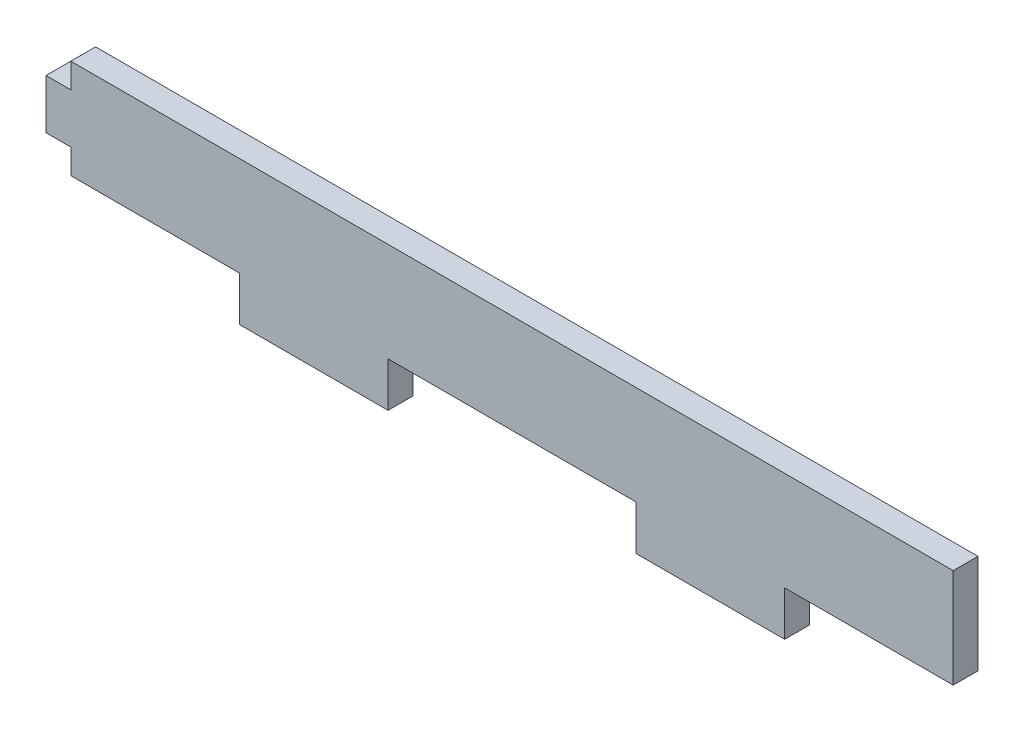
ISO-10303-21;
HEADER;
FILE_DESCRIPTION(('STEP AP214'),'2;1');
FILE_NAME('part.step','',(''),(''),'','','');
FILE_SCHEMA(('AUTOMOTIVE_DESIGN { 1 0 10303 214 1 1 1 1 }'));
ENDSEC;
DATA;
#1=APPLICATION_CONTEXT('core data for automotive mechanical design processes');
#2=APPLICATION_PROTOCOL_DEFINITION('international standard','automotive_design',2000,#1);
#3=PRODUCT_CONTEXT('',#1,'mechanical');
#4=PRODUCT('Part','Part','',(#3));
#5=PRODUCT_RELATED_PRODUCT_CATEGORY('part','',(#4));
#6=PRODUCT_DEFINITION_FORMATION('','',#4);
#7=PRODUCT_DEFINITION_CONTEXT('part definition',#1,'design');
#8=PRODUCT_DEFINITION('design','',#6,#7);
#9=PRODUCT_DEFINITION_SHAPE('','',#8);
#10=(LENGTH_UNIT() NAMED_UNIT(*) SI_UNIT(.MILLI.,.METRE.));
#11=(NAMED_UNIT(*) PLANE_ANGLE_UNIT() SI_UNIT($,.RADIAN.));
#12=(NAMED_UNIT(*) SI_UNIT($,.STERADIAN.) SOLID_ANGLE_UNIT());
#13=UNCERTAINTY_MEASURE_WITH_UNIT(LENGTH_MEASURE(1.E-05),#10,'distance_accuracy_value','');
#14=(GEOMETRIC_REPRESENTATION_CONTEXT(3) GLOBAL_UNCERTAINTY_ASSIGNED_CONTEXT((#13)) GLOBAL_UNIT_ASSIGNED_CONTEXT((#10,
#11,#12)) REPRESENTATION_CONTEXT('',''));
#15=CARTESIAN_POINT('',(0.,0.,0.));
#16=DIRECTION('',(0.,0.,1.));
#17=DIRECTION('',(1.,0.,0.));
#18=AXIS2_PLACEMENT_3D('',#15,#16,#17);
#19=CARTESIAN_POINT('',(0.,5.5,5.));
#20=DIRECTION('',(0.,1.,0.));
#21=DIRECTION('',(0.,0.,1.));
#22=AXIS2_PLACEMENT_3D('',#19,#20,#21);
#23=PLANE('',#22);
#24=DIRECTION('',(1.,0.,0.));
#25=VECTOR('',#24,1.);
#26=CARTESIAN_POINT('',(0.,5.5,0.));
#27=LINE('',#26,#25);
#28=CARTESIAN_POINT('',(149.,5.5,0.));
#29=VERTEX_POINT('',#28);
#30=CARTESIAN_POINT('',(183.,5.5,0.));
#31=VERTEX_POINT('',#30);
#32=EDGE_CURVE('E193',#29,#31,#27,.T.);
#33=ORIENTED_EDGE('',*,*,#32,.T.);
#34=DIRECTION('',(0.,0.,-1.));
#35=VECTOR('',#34,1.);
#36=CARTESIAN_POINT('',(183.,5.5,5.));
#37=LINE('',#36,#35);
#38=CARTESIAN_POINT('',(183.,5.5,5.));
#39=VERTEX_POINT('',#38);
#40=EDGE_CURVE('E11',#39,#31,#37,.T.);
#41=ORIENTED_EDGE('',*,*,#40,.F.);
#42=DIRECTION('',(1.,0.,0.));
#43=VECTOR('',#42,1.);
#44=CARTESIAN_POINT('',(0.,5.5,5.));
#45=LINE('',#44,#43);
#46=CARTESIAN_POINT('',(149.,5.5,5.));
#47=VERTEX_POINT('',#46);
#48=EDGE_CURVE('E234',#47,#39,#45,.T.);
#49=ORIENTED_EDGE('',*,*,#48,.F.);
#50=DIRECTION('',(0.,0.,-1.));
#51=VECTOR('',#50,1.);
#52=CARTESIAN_POINT('',(149.,5.5,5.));
#53=LINE('',#52,#51);
#54=EDGE_CURVE('E63',#47,#29,#53,.T.);
#55=ORIENTED_EDGE('',*,*,#54,.T.);
#56=EDGE_LOOP('',(#33,#41,#49,#55));
#57=FACE_BOUND('',#56,.T.);
#58=ADVANCED_FACE('F47',(#57),#23,.F.);
#59=CARTESIAN_POINT('',(183.,0.,5.));
#60=DIRECTION('',(-1.,0.,0.));
#61=DIRECTION('',(0.,0.,1.));
#62=AXIS2_PLACEMENT_3D('',#59,#60,#61);
#63=PLANE('',#62);
#64=DIRECTION('',(0.,1.,0.));
#65=VECTOR('',#64,1.);
#66=CARTESIAN_POINT('',(183.,0.,0.));
#67=LINE('',#66,#65);
#68=CARTESIAN_POINT('',(183.,25.5,0.));
#69=VERTEX_POINT('',#68);
#70=EDGE_CURVE('E195',#31,#69,#67,.T.);
#71=ORIENTED_EDGE('',*,*,#70,.T.);
#72=DIRECTION('',(0.,0.,-1.));
#73=VECTOR('',#72,1.);
#74=CARTESIAN_POINT('',(183.,25.5,5.));
#75=LINE('',#74,#73);
#76=CARTESIAN_POINT('',(183.,25.5,5.));
#77=VERTEX_POINT('',#76);
#78=EDGE_CURVE('E55',#77,#69,#75,.T.);
#79=ORIENTED_EDGE('',*,*,#78,.F.);
#80=DIRECTION('',(0.,1.,0.));
#81=VECTOR('',#80,1.);
#82=CARTESIAN_POINT('',(183.,0.,5.));
#83=LINE('',#82,#81);
#84=EDGE_CURVE('E126',#39,#77,#83,.T.);
#85=ORIENTED_EDGE('',*,*,#84,.F.);
#86=ORIENTED_EDGE('',*,*,#40,.T.);
#87=EDGE_LOOP('',(#71,#79,#85,#86));
#88=FACE_BOUND('',#87,.T.);
#89=ADVANCED_FACE('F265',(#88),#63,.F.);
#90=CARTESIAN_POINT('',(0.,25.5,5.));
#91=DIRECTION('',(0.,1.,0.));
#92=DIRECTION('',(0.,0.,1.));
#93=AXIS2_PLACEMENT_3D('',#90,#91,#92);
#94=PLANE('',#93);
#95=DIRECTION('',(1.,0.,0.));
#96=VECTOR('',#95,1.);
#97=CARTESIAN_POINT('',(0.,25.5,0.));
#98=LINE('',#97,#96);
#99=CARTESIAN_POINT('',(5.,25.5,0.));
#100=VERTEX_POINT('',#99);
#101=EDGE_CURVE('E198',#100,#69,#98,.T.);
#102=ORIENTED_EDGE('',*,*,#101,.F.);
#103=DIRECTION('',(0.,0.,-1.));
#104=VECTOR('',#103,1.);
#105=CARTESIAN_POINT('',(5.,25.5,5.));
#106=LINE('',#105,#104);
#107=CARTESIAN_POINT('',(5.,25.5,5.));
#108=VERTEX_POINT('',#107);
#109=EDGE_CURVE('E258',#108,#100,#106,.T.);
#110=ORIENTED_EDGE('',*,*,#109,.F.);
#111=DIRECTION('',(1.,0.,0.));
#112=VECTOR('',#111,1.);
#113=CARTESIAN_POINT('',(0.,25.5,5.));
#114=LINE('',#113,#112);
#115=EDGE_CURVE('E264',#108,#77,#114,.T.);
#116=ORIENTED_EDGE('',*,*,#115,.T.);
#117=ORIENTED_EDGE('',*,*,#78,.T.);
#118=EDGE_LOOP('',(#102,#110,#116,#117));
#119=FACE_BOUND('',#118,.T.);
#120=ADVANCED_FACE('F262',(#119),#94,.T.);
#121=CARTESIAN_POINT('',(5.,0.,5.));
#122=DIRECTION('',(-1.,0.,0.));
#123=DIRECTION('',(0.,0.,1.));
#124=AXIS2_PLACEMENT_3D('',#121,#122,#123);
#125=PLANE('',#124);
#126=DIRECTION('',(0.,1.,0.));
#127=VECTOR('',#126,1.);
#128=CARTESIAN_POINT('',(5.,0.,0.));
#129=LINE('',#128,#127);
#130=CARTESIAN_POINT('',(5.,20.5,0.));
#131=VERTEX_POINT('',#130);
#132=EDGE_CURVE('E201',#131,#100,#129,.T.);
#133=ORIENTED_EDGE('',*,*,#132,.F.);
#134=DIRECTION('',(0.,0.,-1.));
#135=VECTOR('',#134,1.);
#136=CARTESIAN_POINT('',(5.,20.5,5.));
#137=LINE('',#136,#135);
#138=CARTESIAN_POINT('',(5.,20.5,5.));
#139=VERTEX_POINT('',#138);
#140=EDGE_CURVE('E256',#139,#131,#137,.T.);
#141=ORIENTED_EDGE('',*,*,#140,.F.);
#142=DIRECTION('',(0.,1.,0.));
#143=VECTOR('',#142,1.);
#144=CARTESIAN_POINT('',(5.,0.,5.));
#145=LINE('',#144,#143);
#146=EDGE_CURVE('E276',#139,#108,#145,.T.);
#147=ORIENTED_EDGE('',*,*,#146,.T.);
#148=ORIENTED_EDGE('',*,*,#109,.T.);
#149=EDGE_LOOP('',(#133,#141,#147,#148));
#150=FACE_BOUND('',#149,.T.);
#151=ADVANCED_FACE('F272',(#150),#125,.T.);
#152=CARTESIAN_POINT('',(0.,20.5,5.));
#153=DIRECTION('',(0.,-1.,0.));
#154=DIRECTION('',(0.,0.,-1.));
#155=AXIS2_PLACEMENT_3D('',#152,#153,#154);
#156=PLANE('',#155);
#157=DIRECTION('',(-1.,0.,0.));
#158=VECTOR('',#157,1.);
#159=CARTESIAN_POINT('',(0.,20.5,0.));
#160=LINE('',#159,#158);
#161=CARTESIAN_POINT('',(0.,20.5,0.));
#162=VERTEX_POINT('',#161);
#163=EDGE_CURVE('E204',#131,#162,#160,.T.);
#164=ORIENTED_EDGE('',*,*,#163,.T.);
#165=DIRECTION('',(0.,0.,-1.));
#166=VECTOR('',#165,1.);
#167=CARTESIAN_POINT('',(0.,20.5,5.));
#168=LINE('',#167,#166);
#169=CARTESIAN_POINT('',(0.,20.5,5.));
#170=VERTEX_POINT('',#169);
#171=EDGE_CURVE('E254',#170,#162,#168,.T.);
#172=ORIENTED_EDGE('',*,*,#171,.F.);
#173=DIRECTION('',(-1.,0.,0.));
#174=VECTOR('',#173,1.);
#175=CARTESIAN_POINT('',(0.,20.5,5.));
#176=LINE('',#175,#174);
#177=EDGE_CURVE('E278',#139,#170,#176,.T.);
#178=ORIENTED_EDGE('',*,*,#177,.F.);
#179=ORIENTED_EDGE('',*,*,#140,.T.);
#180=EDGE_LOOP('',(#164,#172,#178,#179));
#181=FACE_BOUND('',#180,.T.);
#182=ADVANCED_FACE('F435',(#181),#156,.F.);
#183=CARTESIAN_POINT('',(0.,0.,5.));
#184=DIRECTION('',(-1.,0.,0.));
#185=DIRECTION('',(0.,0.,1.));
#186=AXIS2_PLACEMENT_3D('',#183,#184,#185);
#187=PLANE('',#186);
#188=DIRECTION('',(0.,1.,0.));
#189=VECTOR('',#188,1.);
#190=CARTESIAN_POINT('',(0.,0.,0.));
#191=LINE('',#190,#189);
#192=CARTESIAN_POINT('',(0.,10.5,0.));
#193=VERTEX_POINT('',#192);
#194=EDGE_CURVE('E207',#193,#162,#191,.T.);
#195=ORIENTED_EDGE('',*,*,#194,.F.);
#196=DIRECTION('',(0.,0.,-1.));
#197=VECTOR('',#196,1.);
#198=CARTESIAN_POINT('',(0.,10.5,5.));
#199=LINE('',#198,#197);
#200=CARTESIAN_POINT('',(0.,10.5,5.));
#201=VERTEX_POINT('',#200);
#202=EDGE_CURVE('E252',#201,#193,#199,.T.);
#203=ORIENTED_EDGE('',*,*,#202,.F.);
#204=DIRECTION('',(0.,1.,0.));
#205=VECTOR('',#204,1.);
#206=CARTESIAN_POINT('',(0.,0.,5.));
#207=LINE('',#206,#205);
#208=EDGE_CURVE('E284',#201,#170,#207,.T.);
#209=ORIENTED_EDGE('',*,*,#208,.T.);
#210=ORIENTED_EDGE('',*,*,#171,.T.);
#211=EDGE_LOOP('',(#195,#203,#209,#210));
#212=FACE_BOUND('',#211,.T.);
#213=ADVANCED_FACE('F424',(#212),#187,.T.);
#214=CARTESIAN_POINT('',(0.,10.5,5.));
#215=DIRECTION('',(0.,-1.,0.));
#216=DIRECTION('',(1.,0.,0.));
#217=AXIS2_PLACEMENT_3D('',#214,#215,#216);
#218=PLANE('',#217);
#219=DIRECTION('',(-1.,0.,0.));
#220=VECTOR('',#219,1.);
#221=CARTESIAN_POINT('',(0.,10.5,0.));
#222=LINE('',#221,#220);
#223=CARTESIAN_POINT('',(5.,10.5,0.));
#224=VERTEX_POINT('',#223);
#225=EDGE_CURVE('E210',#224,#193,#222,.T.);
#226=ORIENTED_EDGE('',*,*,#225,.F.);
#227=DIRECTION('',(0.,0.,-1.));
#228=VECTOR('',#227,1.);
#229=CARTESIAN_POINT('',(5.,10.5,5.));
#230=LINE('',#229,#228);
#231=CARTESIAN_POINT('',(5.,10.5,5.));
#232=VERTEX_POINT('',#231);
#233=EDGE_CURVE('E250',#232,#224,#230,.T.);
#234=ORIENTED_EDGE('',*,*,#233,.F.);
#235=DIRECTION('',(-1.,0.,0.));
#236=VECTOR('',#235,1.);
#237=CARTESIAN_POINT('',(0.,10.5,5.));
#238=LINE('',#237,#236);
#239=EDGE_CURVE('E287',#232,#201,#238,.T.);
#240=ORIENTED_EDGE('',*,*,#239,.T.);
#241=ORIENTED_EDGE('',*,*,#202,.T.);
#242=EDGE_LOOP('',(#226,#234,#240,#241));
#243=FACE_BOUND('',#242,.T.);
#244=ADVANCED_FACE('F414',(#243),#218,.T.);
#245=CARTESIAN_POINT('',(5.,0.,5.));
#246=DIRECTION('',(-1.,0.,0.));
#247=DIRECTION('',(0.,0.,1.));
#248=AXIS2_PLACEMENT_3D('',#245,#246,#247);
#249=PLANE('',#248);
#250=DIRECTION('',(0.,1.,0.));
#251=VECTOR('',#250,1.);
#252=CARTESIAN_POINT('',(5.,0.,0.));
#253=LINE('',#252,#251);
#254=CARTESIAN_POINT('',(5.,5.5,0.));
#255=VERTEX_POINT('',#254);
#256=EDGE_CURVE('E213',#255,#224,#253,.T.);
#257=ORIENTED_EDGE('',*,*,#256,.F.);
#258=DIRECTION('',(0.,0.,-1.));
#259=VECTOR('',#258,1.);
#260=CARTESIAN_POINT('',(5.,5.5,5.));
#261=LINE('',#260,#259);
#262=CARTESIAN_POINT('',(5.,5.5,5.));
#263=VERTEX_POINT('',#262);
#264=EDGE_CURVE('E248',#263,#255,#261,.T.);
#265=ORIENTED_EDGE('',*,*,#264,.F.);
#266=DIRECTION('',(0.,1.,0.));
#267=VECTOR('',#266,1.);
#268=CARTESIAN_POINT('',(5.,0.,5.));
#269=LINE('',#268,#267);
#270=EDGE_CURVE('E290',#263,#232,#269,.T.);
#271=ORIENTED_EDGE('',*,*,#270,.T.);
#272=ORIENTED_EDGE('',*,*,#233,.T.);
#273=EDGE_LOOP('',(#257,#265,#271,#272));
#274=FACE_BOUND('',#273,.T.);
#275=ADVANCED_FACE('F404',(#274),#249,.T.);
#276=CARTESIAN_POINT('',(0.,5.5,5.));
#277=DIRECTION('',(0.,1.,0.));
#278=DIRECTION('',(0.,0.,1.));
#279=AXIS2_PLACEMENT_3D('',#276,#277,#278);
#280=PLANE('',#279);
#281=DIRECTION('',(1.,0.,0.));
#282=VECTOR('',#281,1.);
#283=CARTESIAN_POINT('',(0.,5.5,0.));
#284=LINE('',#283,#282);
#285=CARTESIAN_POINT('',(39.,5.5,0.));
#286=VERTEX_POINT('',#285);
#287=EDGE_CURVE('E216',#255,#286,#284,.T.);
#288=ORIENTED_EDGE('',*,*,#287,.T.);
#289=DIRECTION('',(0.,0.,-1.));
#290=VECTOR('',#289,1.);
#291=CARTESIAN_POINT('',(39.,5.5,5.));
#292=LINE('',#291,#290);
#293=CARTESIAN_POINT('',(39.,5.5,5.));
#294=VERTEX_POINT('',#293);
#295=EDGE_CURVE('E245',#294,#286,#292,.T.);
#296=ORIENTED_EDGE('',*,*,#295,.F.);
#297=DIRECTION('',(1.,0.,0.));
#298=VECTOR('',#297,1.);
#299=CARTESIAN_POINT('',(0.,5.5,5.));
#300=LINE('',#299,#298);
#301=EDGE_CURVE('E293',#263,#294,#300,.T.);
#302=ORIENTED_EDGE('',*,*,#301,.F.);
#303=ORIENTED_EDGE('',*,*,#264,.T.);
#304=EDGE_LOOP('',(#288,#296,#302,#303));
#305=FACE_BOUND('',#304,.T.);
#306=ADVANCED_FACE('F394',(#305),#280,.F.);
#307=CARTESIAN_POINT('',(39.,0.,5.));
#308=DIRECTION('',(1.,0.,0.));
#309=DIRECTION('',(0.,0.,-1.));
#310=AXIS2_PLACEMENT_3D('',#307,#308,#309);
#311=PLANE('',#310);
#312=DIRECTION('',(0.,-1.,0.));
#313=VECTOR('',#312,1.);
#314=CARTESIAN_POINT('',(39.,0.,0.));
#315=LINE('',#314,#313);
#316=CARTESIAN_POINT('',(39.,-3.5,0.));
#317=VERTEX_POINT('',#316);
#318=EDGE_CURVE('E218',#286,#317,#315,.T.);
#319=ORIENTED_EDGE('',*,*,#318,.T.);
#320=DIRECTION('',(0.,0.,-1.));
#321=VECTOR('',#320,1.);
#322=CARTESIAN_POINT('',(39.,-3.5,5.));
#323=LINE('',#322,#321);
#324=CARTESIAN_POINT('',(39.,-3.5,5.));
#325=VERTEX_POINT('',#324);
#326=EDGE_CURVE('E242',#325,#317,#323,.T.);
#327=ORIENTED_EDGE('',*,*,#326,.F.);
#328=DIRECTION('',(0.,-1.,0.));
#329=VECTOR('',#328,1.);
#330=CARTESIAN_POINT('',(39.,0.,5.));
#331=LINE('',#330,#329);
#332=EDGE_CURVE('E295',#294,#325,#331,.T.);
#333=ORIENTED_EDGE('',*,*,#332,.F.);
#334=ORIENTED_EDGE('',*,*,#295,.T.);
#335=EDGE_LOOP('',(#319,#327,#333,#334));
#336=FACE_BOUND('',#335,.T.);
#337=ADVANCED_FACE('F384',(#336),#311,.F.);
#338=CARTESIAN_POINT('',(0.,-3.5,5.));
#339=DIRECTION('',(0.,1.,0.));
#340=DIRECTION('',(0.,0.,1.));
#341=AXIS2_PLACEMENT_3D('',#338,#339,#340);
#342=PLANE('',#341);
#343=DIRECTION('',(1.,0.,0.));
#344=VECTOR('',#343,1.);
#345=CARTESIAN_POINT('',(0.,-3.5,0.));
#346=LINE('',#345,#344);
#347=CARTESIAN_POINT('',(69.,-3.5,0.));
#348=VERTEX_POINT('',#347);
#349=EDGE_CURVE('E220',#317,#348,#346,.T.);
#350=ORIENTED_EDGE('',*,*,#349,.T.);
#351=DIRECTION('',(0.,0.,-1.));
#352=VECTOR('',#351,1.);
#353=CARTESIAN_POINT('',(69.,-3.5,5.));
#354=LINE('',#353,#352);
#355=CARTESIAN_POINT('',(69.,-3.5,5.));
#356=VERTEX_POINT('',#355);
#357=EDGE_CURVE('E240',#356,#348,#354,.T.);
#358=ORIENTED_EDGE('',*,*,#357,.F.);
#359=DIRECTION('',(1.,0.,0.));
#360=VECTOR('',#359,1.);
#361=CARTESIAN_POINT('',(0.,-3.5,5.));
#362=LINE('',#361,#360);
#363=EDGE_CURVE('E297',#325,#356,#362,.T.);
#364=ORIENTED_EDGE('',*,*,#363,.F.);
#365=ORIENTED_EDGE('',*,*,#326,.T.);
#366=EDGE_LOOP('',(#350,#358,#364,#365));
#367=FACE_BOUND('',#366,.T.);
#368=ADVANCED_FACE('F309',(#367),#342,.F.);
#369=CARTESIAN_POINT('',(69.,0.,5.));
#370=DIRECTION('',(1.,0.,0.));
#371=DIRECTION('',(0.,0.,-1.));
#372=AXIS2_PLACEMENT_3D('',#369,#370,#371);
#373=PLANE('',#372);
#374=DIRECTION('',(0.,-1.,0.));
#375=VECTOR('',#374,1.);
#376=CARTESIAN_POINT('',(69.,0.,0.));
#377=LINE('',#376,#375);
#378=CARTESIAN_POINT('',(69.,5.5,0.));
#379=VERTEX_POINT('',#378);
#380=EDGE_CURVE('E223',#379,#348,#377,.T.);
#381=ORIENTED_EDGE('',*,*,#380,.F.);
#382=DIRECTION('',(0.,0.,-1.));
#383=VECTOR('',#382,1.);
#384=CARTESIAN_POINT('',(69.,5.5,5.));
#385=LINE('',#384,#383);
#386=CARTESIAN_POINT('',(69.,5.5,5.));
#387=VERTEX_POINT('',#386);
#388=EDGE_CURVE('E238',#387,#379,#385,.T.);
#389=ORIENTED_EDGE('',*,*,#388,.F.);
#390=DIRECTION('',(0.,-1.,0.));
#391=VECTOR('',#390,1.);
#392=CARTESIAN_POINT('',(69.,0.,5.));
#393=LINE('',#392,#391);
#394=EDGE_CURVE('E299',#387,#356,#393,.T.);
#395=ORIENTED_EDGE('',*,*,#394,.T.);
#396=ORIENTED_EDGE('',*,*,#357,.T.);
#397=EDGE_LOOP('',(#381,#389,#395,#396));
#398=FACE_BOUND('',#397,.T.);
#399=ADVANCED_FACE('F303',(#398),#373,.T.);
#400=CARTESIAN_POINT('',(0.,5.5,5.));
#401=DIRECTION('',(0.,1.,0.));
#402=DIRECTION('',(0.,0.,1.));
#403=AXIS2_PLACEMENT_3D('',#400,#401,#402);
#404=PLANE('',#403);
#405=DIRECTION('',(1.,0.,0.));
#406=VECTOR('',#405,1.);
#407=CARTESIAN_POINT('',(0.,5.5,0.));
#408=LINE('',#407,#406);
#409=CARTESIAN_POINT('',(119.,5.5,0.));
#410=VERTEX_POINT('',#409);
#411=EDGE_CURVE('E226',#379,#410,#408,.T.);
#412=ORIENTED_EDGE('',*,*,#411,.T.);
#413=DIRECTION('',(0.,0.,-1.));
#414=VECTOR('',#413,1.);
#415=CARTESIAN_POINT('',(119.,5.5,5.));
#416=LINE('',#415,#414);
#417=CARTESIAN_POINT('',(119.,5.5,5.));
#418=VERTEX_POINT('',#417);
#419=EDGE_CURVE('E185',#418,#410,#416,.T.);
#420=ORIENTED_EDGE('',*,*,#419,.F.);
#421=DIRECTION('',(1.,0.,0.));
#422=VECTOR('',#421,1.);
#423=CARTESIAN_POINT('',(0.,5.5,5.));
#424=LINE('',#423,#422);
#425=EDGE_CURVE('E173',#387,#418,#424,.T.);
#426=ORIENTED_EDGE('',*,*,#425,.F.);
#427=ORIENTED_EDGE('',*,*,#388,.T.);
#428=EDGE_LOOP('',(#412,#420,#426,#427));
#429=FACE_BOUND('',#428,.T.);
#430=ADVANCED_FACE('F314',(#429),#404,.F.);
#431=CARTESIAN_POINT('',(119.,0.,5.));
#432=DIRECTION('',(1.,0.,0.));
#433=DIRECTION('',(0.,0.,-1.));
#434=AXIS2_PLACEMENT_3D('',#431,#432,#433);
#435=PLANE('',#434);
#436=DIRECTION('',(0.,-1.,0.));
#437=VECTOR('',#436,1.);
#438=CARTESIAN_POINT('',(119.,0.,0.));
#439=LINE('',#438,#437);
#440=CARTESIAN_POINT('',(119.,-3.5,0.));
#441=VERTEX_POINT('',#440);
#442=EDGE_CURVE('E182',#410,#441,#439,.T.);
#443=ORIENTED_EDGE('',*,*,#442,.T.);
#444=DIRECTION('',(0.,0.,-1.));
#445=VECTOR('',#444,1.);
#446=CARTESIAN_POINT('',(119.,-3.5,5.));
#447=LINE('',#446,#445);
#448=CARTESIAN_POINT('',(119.,-3.5,5.));
#449=VERTEX_POINT('',#448);
#450=EDGE_CURVE('E179',#449,#441,#447,.T.);
#451=ORIENTED_EDGE('',*,*,#450,.F.);
#452=DIRECTION('',(0.,-1.,0.));
#453=VECTOR('',#452,1.);
#454=CARTESIAN_POINT('',(119.,0.,5.));
#455=LINE('',#454,#453);
#456=EDGE_CURVE('E165',#418,#449,#455,.T.);
#457=ORIENTED_EDGE('',*,*,#456,.F.);
#458=ORIENTED_EDGE('',*,*,#419,.T.);
#459=EDGE_LOOP('',(#443,#451,#457,#458));
#460=FACE_BOUND('',#459,.T.);
#461=ADVANCED_FACE('F180',(#460),#435,.F.);
#462=CARTESIAN_POINT('',(0.,-3.5,5.));
#463=DIRECTION('',(0.,1.,0.));
#464=DIRECTION('',(0.,0.,1.));
#465=AXIS2_PLACEMENT_3D('',#462,#463,#464);
#466=PLANE('',#465);
#467=DIRECTION('',(1.,0.,0.));
#468=VECTOR('',#467,1.);
#469=CARTESIAN_POINT('',(0.,-3.5,0.));
#470=LINE('',#469,#468);
#471=CARTESIAN_POINT('',(149.,-3.5,0.));
#472=VERTEX_POINT('',#471);
#473=EDGE_CURVE('E229',#441,#472,#470,.T.);
#474=ORIENTED_EDGE('',*,*,#473,.T.);
#475=DIRECTION('',(0.,0.,-1.));
#476=VECTOR('',#475,1.);
#477=CARTESIAN_POINT('',(149.,-3.5,5.));
#478=LINE('',#477,#476);
#479=CARTESIAN_POINT('',(149.,-3.5,5.));
#480=VERTEX_POINT('',#479);
#481=EDGE_CURVE('E114',#480,#472,#478,.T.);
#482=ORIENTED_EDGE('',*,*,#481,.F.);
#483=DIRECTION('',(1.,0.,0.));
#484=VECTOR('',#483,1.);
#485=CARTESIAN_POINT('',(0.,-3.5,5.));
#486=LINE('',#485,#484);
#487=EDGE_CURVE('E170',#449,#480,#486,.T.);
#488=ORIENTED_EDGE('',*,*,#487,.F.);
#489=ORIENTED_EDGE('',*,*,#450,.T.);
#490=EDGE_LOOP('',(#474,#482,#488,#489));
#491=FACE_BOUND('',#490,.T.);
#492=ADVANCED_FACE('F187',(#491),#466,.F.);
#493=CARTESIAN_POINT('',(149.,0.,5.));
#494=DIRECTION('',(1.,0.,0.));
#495=DIRECTION('',(0.,0.,-1.));
#496=AXIS2_PLACEMENT_3D('',#493,#494,#495);
#497=PLANE('',#496);
#498=DIRECTION('',(0.,-1.,0.));
#499=VECTOR('',#498,1.);
#500=CARTESIAN_POINT('',(149.,0.,0.));
#501=LINE('',#500,#499);
#502=EDGE_CURVE('E231',#29,#472,#501,.T.);
#503=ORIENTED_EDGE('',*,*,#502,.F.);
#504=ORIENTED_EDGE('',*,*,#54,.F.);
#505=DIRECTION('',(0.,-1.,0.));
#506=VECTOR('',#505,1.);
#507=CARTESIAN_POINT('',(149.,0.,5.));
#508=LINE('',#507,#506);
#509=EDGE_CURVE('E188',#47,#480,#508,.T.);
#510=ORIENTED_EDGE('',*,*,#509,.T.);
#511=ORIENTED_EDGE('',*,*,#481,.T.);
#512=EDGE_LOOP('',(#503,#504,#510,#511));
#513=FACE_BOUND('',#512,.T.);
#514=ADVANCED_FACE('F327',(#513),#497,.T.);
#515=CARTESIAN_POINT('',(0.,0.,5.));
#516=DIRECTION('',(0.,0.,1.));
#517=DIRECTION('',(1.,0.,0.));
#518=AXIS2_PLACEMENT_3D('',#515,#516,#517);
#519=PLANE('',#518);
#520=ORIENTED_EDGE('',*,*,#48,.T.);
#521=ORIENTED_EDGE('',*,*,#84,.T.);
#522=ORIENTED_EDGE('',*,*,#115,.F.);
#523=ORIENTED_EDGE('',*,*,#146,.F.);
#524=ORIENTED_EDGE('',*,*,#177,.T.);
#525=ORIENTED_EDGE('',*,*,#208,.F.);
#526=ORIENTED_EDGE('',*,*,#239,.F.);
#527=ORIENTED_EDGE('',*,*,#270,.F.);
#528=ORIENTED_EDGE('',*,*,#301,.T.);
#529=ORIENTED_EDGE('',*,*,#332,.T.);
#530=ORIENTED_EDGE('',*,*,#363,.T.);
#531=ORIENTED_EDGE('',*,*,#394,.F.);
#532=ORIENTED_EDGE('',*,*,#425,.T.);
#533=ORIENTED_EDGE('',*,*,#456,.T.);
#534=ORIENTED_EDGE('',*,*,#487,.T.);
#535=ORIENTED_EDGE('',*,*,#509,.F.);
#536=EDGE_LOOP('',(#520,#521,#522,#523,#524,#525,#526,#527,#528,#529,#530,#531,#532,#533,#534,#535));
#537=FACE_BOUND('',#536,.T.);
#538=ADVANCED_FACE('F167',(#537),#519,.T.);
#539=CARTESIAN_POINT('',(0.,0.,0.));
#540=DIRECTION('',(0.,0.,1.));
#541=DIRECTION('',(1.,0.,0.));
#542=AXIS2_PLACEMENT_3D('',#539,#540,#541);
#543=PLANE('',#542);
#544=ORIENTED_EDGE('',*,*,#32,.F.);
#545=ORIENTED_EDGE('',*,*,#502,.T.);
#546=ORIENTED_EDGE('',*,*,#473,.F.);
#547=ORIENTED_EDGE('',*,*,#442,.F.);
#548=ORIENTED_EDGE('',*,*,#411,.F.);
#549=ORIENTED_EDGE('',*,*,#380,.T.);
#550=ORIENTED_EDGE('',*,*,#349,.F.);
#551=ORIENTED_EDGE('',*,*,#318,.F.);
#552=ORIENTED_EDGE('',*,*,#287,.F.);
#553=ORIENTED_EDGE('',*,*,#256,.T.);
#554=ORIENTED_EDGE('',*,*,#225,.T.);
#555=ORIENTED_EDGE('',*,*,#194,.T.);
#556=ORIENTED_EDGE('',*,*,#163,.F.);
#557=ORIENTED_EDGE('',*,*,#132,.T.);
#558=ORIENTED_EDGE('',*,*,#101,.T.);
#559=ORIENTED_EDGE('',*,*,#70,.F.);
#560=EDGE_LOOP('',(#544,#545,#546,#547,#548,#549,#550,#551,#552,#553,#554,#555,#556,#557,#558,#559));
#561=FACE_BOUND('',#560,.T.);
#562=ADVANCED_FACE('F268',(#561),#543,.F.);
#563=CLOSED_SHELL('',(#58,#89,#120,#151,#182,#213,#244,#275,#306,#337,#368,#399,#430,#461,#492,
#514,#538,#562));
#564=MANIFOLD_SOLID_BREP('B2',#563);
#565=ADVANCED_BREP_SHAPE_REPRESENTATION('',(#18,#564),#14);
#566=SHAPE_DEFINITION_REPRESENTATION(#9,#565);
ENDSEC;
END-ISO-10303-21;
